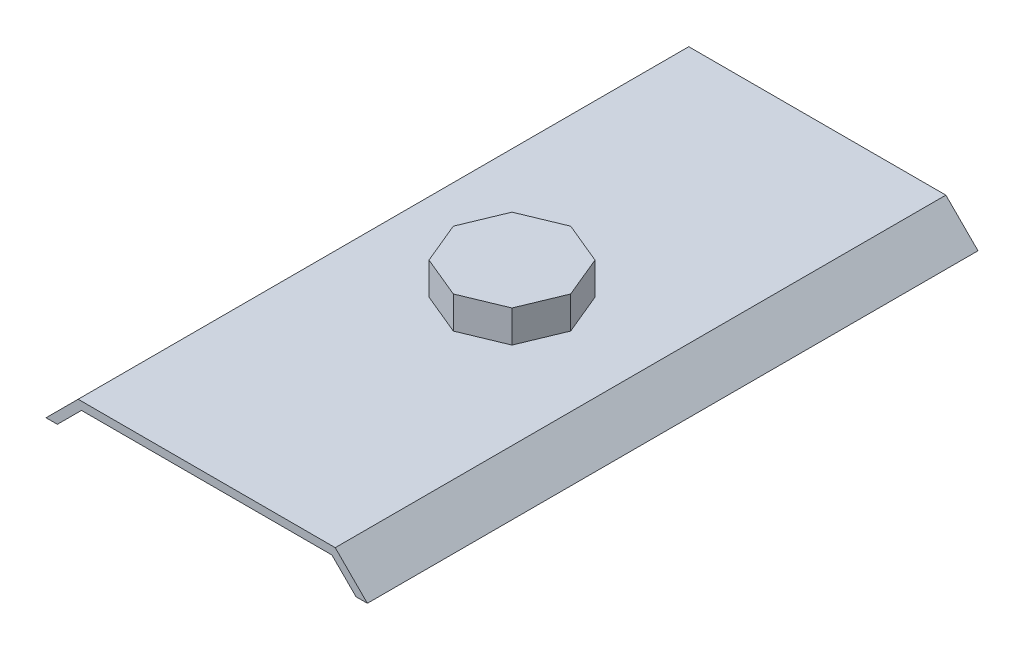
ISO-10303-21;
HEADER;
FILE_DESCRIPTION(('STEP AP214'),'2;1');
FILE_NAME('part.step','',(''),(''),'','','');
FILE_SCHEMA(('AUTOMOTIVE_DESIGN { 1 0 10303 214 1 1 1 1 }'));
ENDSEC;
DATA;
#1=APPLICATION_CONTEXT('core data for automotive mechanical design processes');
#2=APPLICATION_PROTOCOL_DEFINITION('international standard','automotive_design',2000,#1);
#3=PRODUCT_CONTEXT('',#1,'mechanical');
#4=PRODUCT('Part','Part','',(#3));
#5=PRODUCT_RELATED_PRODUCT_CATEGORY('part','',(#4));
#6=PRODUCT_DEFINITION_FORMATION('','',#4);
#7=PRODUCT_DEFINITION_CONTEXT('part definition',#1,'design');
#8=PRODUCT_DEFINITION('design','',#6,#7);
#9=PRODUCT_DEFINITION_SHAPE('','',#8);
#10=(LENGTH_UNIT() NAMED_UNIT(*) SI_UNIT(.MILLI.,.METRE.));
#11=(NAMED_UNIT(*) PLANE_ANGLE_UNIT() SI_UNIT($,.RADIAN.));
#12=(NAMED_UNIT(*) SI_UNIT($,.STERADIAN.) SOLID_ANGLE_UNIT());
#13=UNCERTAINTY_MEASURE_WITH_UNIT(LENGTH_MEASURE(1.E-05),#10,'distance_accuracy_value','');
#14=(GEOMETRIC_REPRESENTATION_CONTEXT(3) GLOBAL_UNCERTAINTY_ASSIGNED_CONTEXT((#13)) GLOBAL_UNIT_ASSIGNED_CONTEXT((#10,
#11,#12)) REPRESENTATION_CONTEXT('',''));
#15=CARTESIAN_POINT('',(0.,0.,0.));
#16=DIRECTION('',(0.,0.,1.));
#17=DIRECTION('',(1.,0.,0.));
#18=AXIS2_PLACEMENT_3D('',#15,#16,#17);
#19=CARTESIAN_POINT('',(-105.319743878931,105.319743878931,482.6));
#20=DIRECTION('',(-0.707106781186548,0.707106781186548,0.));
#21=DIRECTION('',(-0.707106781186548,-0.707106781186548,0.));
#22=AXIS2_PLACEMENT_3D('',#19,#20,#21);
#23=PLANE('',#22);
#24=DIRECTION('',(0.707106781186548,0.707106781186548,0.));
#25=VECTOR('',#24,1.);
#26=CARTESIAN_POINT('',(-105.319743878931,105.319743878931,-482.6));
#27=LINE('',#26,#25);
#28=CARTESIAN_POINT('',(-236.039487757862,-25.4,-482.6));
#29=VERTEX_POINT('',#28);
#30=CARTESIAN_POINT('',(-197.939487757862,12.7,-482.6));
#31=VERTEX_POINT('',#30);
#32=EDGE_CURVE('E209',#29,#31,#27,.T.);
#33=ORIENTED_EDGE('',*,*,#32,.T.);
#34=DIRECTION('',(0.,0.,-1.));
#35=VECTOR('',#34,1.);
#36=CARTESIAN_POINT('',(-197.939487757862,12.7,482.6));
#37=LINE('',#36,#35);
#38=CARTESIAN_POINT('',(-197.939487757862,12.7,482.6));
#39=VERTEX_POINT('',#38);
#40=EDGE_CURVE('E269',#39,#31,#37,.T.);
#41=ORIENTED_EDGE('',*,*,#40,.F.);
#42=DIRECTION('',(0.707106781186548,0.707106781186548,0.));
#43=VECTOR('',#42,1.);
#44=CARTESIAN_POINT('',(-105.319743878931,105.319743878931,482.6));
#45=LINE('',#44,#43);
#46=CARTESIAN_POINT('',(-236.039487757862,-25.4,482.6));
#47=VERTEX_POINT('',#46);
#48=EDGE_CURVE('E212',#47,#39,#45,.T.);
#49=ORIENTED_EDGE('',*,*,#48,.F.);
#50=DIRECTION('',(0.,0.,-1.));
#51=VECTOR('',#50,1.);
#52=CARTESIAN_POINT('',(-236.039487757862,-25.4,482.6));
#53=LINE('',#52,#51);
#54=EDGE_CURVE('E233',#47,#29,#53,.T.);
#55=ORIENTED_EDGE('',*,*,#54,.T.);
#56=EDGE_LOOP('',(#33,#41,#49,#55));
#57=FACE_BOUND('',#56,.T.);
#58=ADVANCED_FACE('F38',(#57),#23,.F.);
#59=CARTESIAN_POINT('',(0.,12.7,482.6));
#60=DIRECTION('',(0.,1.,0.));
#61=DIRECTION('',(-1.,0.,0.));
#62=AXIS2_PLACEMENT_3D('',#59,#60,#61);
#63=PLANE('',#62);
#64=CARTESIAN_POINT('',(-145.808181246566,12.7,-254.));
#65=DIRECTION('',(0.,1.,0.));
#66=DIRECTION('',(-1.,0.,0.));
#67=AXIS2_PLACEMENT_3D('',#64,#65,#66);
#68=CIRCLE('',#67,50.8);
#69=CARTESIAN_POINT('',(-196.608181246566,12.7,-254.));
#70=VERTEX_POINT('',#69);
#71=EDGE_CURVE('E11',#70,#70,#68,.F.);
#72=ORIENTED_EDGE('',*,*,#71,.F.);
#73=EDGE_LOOP('',(#72));
#74=FACE_BOUND('',#73,.T.);
#75=CARTESIAN_POINT('',(145.808181246566,12.7,-254.));
#76=DIRECTION('',(0.,-1.,0.));
#77=DIRECTION('',(1.,0.,0.));
#78=AXIS2_PLACEMENT_3D('',#75,#76,#77);
#79=CIRCLE('',#78,50.8);
#80=CARTESIAN_POINT('',(196.608181246566,12.7,-254.));
#81=VERTEX_POINT('',#80);
#82=EDGE_CURVE('E183',#81,#81,#79,.F.);
#83=ORIENTED_EDGE('',*,*,#82,.T.);
#84=EDGE_LOOP('',(#83));
#85=FACE_BOUND('',#84,.T.);
#86=CARTESIAN_POINT('',(145.808181246566,12.7,254.));
#87=DIRECTION('',(0.,1.,0.));
#88=DIRECTION('',(-1.,0.,0.));
#89=AXIS2_PLACEMENT_3D('',#86,#87,#88);
#90=CIRCLE('',#89,50.8);
#91=CARTESIAN_POINT('',(95.0081812465659,12.7,254.));
#92=VERTEX_POINT('',#91);
#93=EDGE_CURVE('E275',#92,#92,#90,.F.);
#94=ORIENTED_EDGE('',*,*,#93,.F.);
#95=EDGE_LOOP('',(#94));
#96=FACE_BOUND('',#95,.T.);
#97=CARTESIAN_POINT('',(-145.808181246566,12.7,254.));
#98=DIRECTION('',(0.,-1.,0.));
#99=DIRECTION('',(1.,0.,0.));
#100=AXIS2_PLACEMENT_3D('',#97,#98,#99);
#101=CIRCLE('',#100,50.8);
#102=CARTESIAN_POINT('',(-95.0081812465659,12.7,254.));
#103=VERTEX_POINT('',#102);
#104=EDGE_CURVE('E200',#103,#103,#101,.F.);
#105=ORIENTED_EDGE('',*,*,#104,.T.);
#106=EDGE_LOOP('',(#105));
#107=FACE_BOUND('',#106,.T.);
#108=DIRECTION('',(1.,0.,0.));
#109=VECTOR('',#108,1.);
#110=CARTESIAN_POINT('',(0.,12.7,-482.6));
#111=LINE('',#110,#109);
#112=CARTESIAN_POINT('',(197.939487757862,12.7,-482.6));
#113=VERTEX_POINT('',#112);
#114=EDGE_CURVE('E236',#31,#113,#111,.T.);
#115=ORIENTED_EDGE('',*,*,#114,.T.);
#116=DIRECTION('',(0.,0.,-1.));
#117=VECTOR('',#116,1.);
#118=CARTESIAN_POINT('',(197.939487757862,12.7,482.6));
#119=LINE('',#118,#117);
#120=CARTESIAN_POINT('',(197.939487757862,12.7,482.6));
#121=VERTEX_POINT('',#120);
#122=EDGE_CURVE('E267',#121,#113,#119,.T.);
#123=ORIENTED_EDGE('',*,*,#122,.F.);
#124=DIRECTION('',(1.,0.,0.));
#125=VECTOR('',#124,1.);
#126=CARTESIAN_POINT('',(0.,12.7,482.6));
#127=LINE('',#126,#125);
#128=EDGE_CURVE('E215',#39,#121,#127,.T.);
#129=ORIENTED_EDGE('',*,*,#128,.F.);
#130=ORIENTED_EDGE('',*,*,#40,.T.);
#131=EDGE_LOOP('',(#115,#123,#129,#130));
#132=FACE_BOUND('',#131,.T.);
#133=ADVANCED_FACE('F297',(#74,#85,#96,#107,#132),#63,.F.);
#134=CARTESIAN_POINT('',(105.319743878931,105.319743878931,482.6));
#135=DIRECTION('',(-0.707106781186547,-0.707106781186548,0.));
#136=DIRECTION('',(0.707106781186548,-0.707106781186547,0.));
#137=AXIS2_PLACEMENT_3D('',#134,#135,#136);
#138=PLANE('',#137);
#139=DIRECTION('',(-0.707106781186548,0.707106781186547,0.));
#140=VECTOR('',#139,1.);
#141=CARTESIAN_POINT('',(105.319743878931,105.319743878931,-482.6));
#142=LINE('',#141,#140);
#143=CARTESIAN_POINT('',(236.039487757862,-25.4,-482.6));
#144=VERTEX_POINT('',#143);
#145=EDGE_CURVE('E239',#144,#113,#142,.T.);
#146=ORIENTED_EDGE('',*,*,#145,.F.);
#147=DIRECTION('',(0.,0.,-1.));
#148=VECTOR('',#147,1.);
#149=CARTESIAN_POINT('',(236.039487757862,-25.4,482.6));
#150=LINE('',#149,#148);
#151=CARTESIAN_POINT('',(236.039487757862,-25.4,482.6));
#152=VERTEX_POINT('',#151);
#153=EDGE_CURVE('E265',#152,#144,#150,.T.);
#154=ORIENTED_EDGE('',*,*,#153,.F.);
#155=DIRECTION('',(-0.707106781186548,0.707106781186547,0.));
#156=VECTOR('',#155,1.);
#157=CARTESIAN_POINT('',(105.319743878931,105.319743878931,482.6));
#158=LINE('',#157,#156);
#159=EDGE_CURVE('E218',#152,#121,#158,.T.);
#160=ORIENTED_EDGE('',*,*,#159,.T.);
#161=ORIENTED_EDGE('',*,*,#122,.T.);
#162=EDGE_LOOP('',(#146,#154,#160,#161));
#163=FACE_BOUND('',#162,.T.);
#164=ADVANCED_FACE('F312',(#163),#138,.T.);
#165=CARTESIAN_POINT('',(0.,-25.4,482.6));
#166=DIRECTION('',(0.,1.,0.));
#167=DIRECTION('',(0.,0.,1.));
#168=AXIS2_PLACEMENT_3D('',#165,#166,#167);
#169=PLANE('',#168);
#170=DIRECTION('',(1.,0.,0.));
#171=VECTOR('',#170,1.);
#172=CARTESIAN_POINT('',(0.,-25.4,-482.6));
#173=LINE('',#172,#171);
#174=CARTESIAN_POINT('',(254.,-25.4,-482.6));
#175=VERTEX_POINT('',#174);
#176=EDGE_CURVE('E242',#144,#175,#173,.T.);
#177=ORIENTED_EDGE('',*,*,#176,.T.);
#178=DIRECTION('',(0.,0.,-1.));
#179=VECTOR('',#178,1.);
#180=CARTESIAN_POINT('',(254.,-25.4,482.6));
#181=LINE('',#180,#179);
#182=CARTESIAN_POINT('',(254.,-25.4,482.6));
#183=VERTEX_POINT('',#182);
#184=EDGE_CURVE('E262',#183,#175,#181,.T.);
#185=ORIENTED_EDGE('',*,*,#184,.F.);
#186=DIRECTION('',(1.,0.,0.));
#187=VECTOR('',#186,1.);
#188=CARTESIAN_POINT('',(0.,-25.4,482.6));
#189=LINE('',#188,#187);
#190=EDGE_CURVE('E221',#152,#183,#189,.T.);
#191=ORIENTED_EDGE('',*,*,#190,.F.);
#192=ORIENTED_EDGE('',*,*,#153,.T.);
#193=EDGE_LOOP('',(#177,#185,#191,#192));
#194=FACE_BOUND('',#193,.T.);
#195=ADVANCED_FACE('F347',(#194),#169,.F.);
#196=CARTESIAN_POINT('',(114.300000000001,114.3,482.6));
#197=DIRECTION('',(-0.707106781186549,-0.707106781186546,0.));
#198=DIRECTION('',(0.707106781186546,-0.707106781186549,0.));
#199=AXIS2_PLACEMENT_3D('',#196,#197,#198);
#200=PLANE('',#199);
#201=DIRECTION('',(-0.707106781186546,0.707106781186549,0.));
#202=VECTOR('',#201,1.);
#203=CARTESIAN_POINT('',(114.300000000001,114.3,-482.6));
#204=LINE('',#203,#202);
#205=CARTESIAN_POINT('',(203.2,25.4,-482.6));
#206=VERTEX_POINT('',#205);
#207=EDGE_CURVE('E244',#175,#206,#204,.T.);
#208=ORIENTED_EDGE('',*,*,#207,.T.);
#209=DIRECTION('',(0.,0.,-1.));
#210=VECTOR('',#209,1.);
#211=CARTESIAN_POINT('',(203.2,25.4,482.6));
#212=LINE('',#211,#210);
#213=CARTESIAN_POINT('',(203.2,25.4,482.6));
#214=VERTEX_POINT('',#213);
#215=EDGE_CURVE('E260',#214,#206,#212,.T.);
#216=ORIENTED_EDGE('',*,*,#215,.F.);
#217=DIRECTION('',(-0.707106781186546,0.707106781186549,0.));
#218=VECTOR('',#217,1.);
#219=CARTESIAN_POINT('',(114.300000000001,114.3,482.6));
#220=LINE('',#219,#218);
#221=EDGE_CURVE('E223',#183,#214,#220,.T.);
#222=ORIENTED_EDGE('',*,*,#221,.F.);
#223=ORIENTED_EDGE('',*,*,#184,.T.);
#224=EDGE_LOOP('',(#208,#216,#222,#223));
#225=FACE_BOUND('',#224,.T.);
#226=ADVANCED_FACE('F343',(#225),#200,.F.);
#227=CARTESIAN_POINT('',(0.,25.4,482.6));
#228=DIRECTION('',(0.,1.,0.));
#229=DIRECTION('',(0.,0.,1.));
#230=AXIS2_PLACEMENT_3D('',#227,#228,#229);
#231=PLANE('',#230);
#232=DIRECTION('',(0.382683432365079,0.,-0.923879532511291));
#233=VECTOR('',#232,1.);
#234=CARTESIAN_POINT('',(65.599833080608,25.4,65.5998330806064));
#235=LINE('',#234,#233);
#236=CARTESIAN_POINT('',(65.599833080608,25.4,65.5998330806064));
#237=VERTEX_POINT('',#236);
#238=CARTESIAN_POINT('',(92.7721736320058,25.4,-9.43689570931383E-13));
#239=VERTEX_POINT('',#238);
#240=EDGE_CURVE('E52',#237,#239,#235,.T.);
#241=ORIENTED_EDGE('',*,*,#240,.F.);
#242=DIRECTION('',(0.923879532511283,0.,-0.3826834323651));
#243=VECTOR('',#242,1.);
#244=CARTESIAN_POINT('',(9.66056281725772E-13,25.4,92.7721736320058));
#245=LINE('',#244,#243);
#246=CARTESIAN_POINT('',(9.66056281725772E-13,25.4,92.7721736320058));
#247=VERTEX_POINT('',#246);
#248=EDGE_CURVE('E56',#247,#237,#245,.T.);
#249=ORIENTED_EDGE('',*,*,#248,.F.);
#250=DIRECTION('',(0.923879532511291,0.,0.38268343236508));
#251=VECTOR('',#250,1.);
#252=CARTESIAN_POINT('',(-65.5998330806065,25.4,65.5998330806078));
#253=LINE('',#252,#251);
#254=CARTESIAN_POINT('',(-65.5998330806065,25.4,65.5998330806078));
#255=VERTEX_POINT('',#254);
#256=EDGE_CURVE('E658',#255,#247,#253,.T.);
#257=ORIENTED_EDGE('',*,*,#256,.F.);
#258=DIRECTION('',(0.382683432365099,0.,0.923879532511283));
#259=VECTOR('',#258,1.);
#260=CARTESIAN_POINT('',(-92.7721736320058,25.4,9.29811783123569E-13));
#261=LINE('',#260,#259);
#262=CARTESIAN_POINT('',(-92.7721736320058,25.4,9.29811783123569E-13));
#263=VERTEX_POINT('',#262);
#264=EDGE_CURVE('E692',#263,#255,#261,.T.);
#265=ORIENTED_EDGE('',*,*,#264,.F.);
#266=DIRECTION('',(-0.38268343236508,0.,0.923879532511291));
#267=VECTOR('',#266,1.);
#268=CARTESIAN_POINT('',(-65.5998330806078,25.4,-65.5998330806065));
#269=LINE('',#268,#267);
#270=CARTESIAN_POINT('',(-65.5998330806078,25.4,-65.5998330806065));
#271=VERTEX_POINT('',#270);
#272=EDGE_CURVE('E685',#271,#263,#269,.T.);
#273=ORIENTED_EDGE('',*,*,#272,.F.);
#274=DIRECTION('',(-0.923879532511283,0.,0.382683432365099));
#275=VECTOR('',#274,1.);
#276=CARTESIAN_POINT('',(-9.57567358739198E-13,25.4,-92.7721736320059));
#277=LINE('',#276,#275);
#278=CARTESIAN_POINT('',(-9.57567358739198E-13,25.4,-92.7721736320059));
#279=VERTEX_POINT('',#278);
#280=EDGE_CURVE('E679',#279,#271,#277,.T.);
#281=ORIENTED_EDGE('',*,*,#280,.F.);
#282=DIRECTION('',(-0.923879532511291,0.,-0.38268343236508));
#283=VECTOR('',#282,1.);
#284=CARTESIAN_POINT('',(65.5998330806065,25.4,-65.5998330806078));
#285=LINE('',#284,#283);
#286=CARTESIAN_POINT('',(65.5998330806065,25.4,-65.5998330806078));
#287=VERTEX_POINT('',#286);
#288=EDGE_CURVE('E682',#287,#279,#285,.T.);
#289=ORIENTED_EDGE('',*,*,#288,.F.);
#290=DIRECTION('',(-0.382683432365099,0.,-0.923879532511283));
#291=VECTOR('',#290,1.);
#292=CARTESIAN_POINT('',(92.7721736320058,25.4,-9.43689570931383E-13));
#293=LINE('',#292,#291);
#294=EDGE_CURVE('E683',#239,#287,#293,.T.);
#295=ORIENTED_EDGE('',*,*,#294,.F.);
#296=EDGE_LOOP('',(#241,#249,#257,#265,#273,#281,#289,#295));
#297=FACE_BOUND('',#296,.T.);
#298=DIRECTION('',(1.,0.,0.));
#299=VECTOR('',#298,1.);
#300=CARTESIAN_POINT('',(0.,25.4,-482.6));
#301=LINE('',#300,#299);
#302=CARTESIAN_POINT('',(-203.2,25.4,-482.6));
#303=VERTEX_POINT('',#302);
#304=EDGE_CURVE('E247',#303,#206,#301,.T.);
#305=ORIENTED_EDGE('',*,*,#304,.F.);
#306=DIRECTION('',(0.,0.,-1.));
#307=VECTOR('',#306,1.);
#308=CARTESIAN_POINT('',(-203.2,25.4,482.6));
#309=LINE('',#308,#307);
#310=CARTESIAN_POINT('',(-203.2,25.4,482.6));
#311=VERTEX_POINT('',#310);
#312=EDGE_CURVE('E258',#311,#303,#309,.T.);
#313=ORIENTED_EDGE('',*,*,#312,.F.);
#314=DIRECTION('',(1.,0.,0.));
#315=VECTOR('',#314,1.);
#316=CARTESIAN_POINT('',(0.,25.4,482.6));
#317=LINE('',#316,#315);
#318=EDGE_CURVE('E225',#311,#214,#317,.T.);
#319=ORIENTED_EDGE('',*,*,#318,.T.);
#320=ORIENTED_EDGE('',*,*,#215,.T.);
#321=EDGE_LOOP('',(#305,#313,#319,#320));
#322=FACE_BOUND('',#321,.T.);
#323=ADVANCED_FACE('F339',(#297,#322),#231,.T.);
#324=CARTESIAN_POINT('',(-114.3,114.3,482.6));
#325=DIRECTION('',(-0.707106781186549,0.707106781186547,0.));
#326=DIRECTION('',(-0.707106781186547,-0.707106781186549,0.));
#327=AXIS2_PLACEMENT_3D('',#324,#325,#326);
#328=PLANE('',#327);
#329=DIRECTION('',(0.707106781186546,0.707106781186549,0.));
#330=VECTOR('',#329,1.);
#331=CARTESIAN_POINT('',(-114.3,114.3,-482.6));
#332=LINE('',#331,#330);
#333=CARTESIAN_POINT('',(-254.,-25.4,-482.6));
#334=VERTEX_POINT('',#333);
#335=EDGE_CURVE('E250',#334,#303,#332,.T.);
#336=ORIENTED_EDGE('',*,*,#335,.F.);
#337=DIRECTION('',(0.,0.,-1.));
#338=VECTOR('',#337,1.);
#339=CARTESIAN_POINT('',(-254.,-25.4,482.6));
#340=LINE('',#339,#338);
#341=CARTESIAN_POINT('',(-254.,-25.4,482.6));
#342=VERTEX_POINT('',#341);
#343=EDGE_CURVE('E256',#342,#334,#340,.T.);
#344=ORIENTED_EDGE('',*,*,#343,.F.);
#345=DIRECTION('',(0.707106781186546,0.707106781186549,0.));
#346=VECTOR('',#345,1.);
#347=CARTESIAN_POINT('',(-114.3,114.3,482.6));
#348=LINE('',#347,#346);
#349=EDGE_CURVE('E228',#342,#311,#348,.T.);
#350=ORIENTED_EDGE('',*,*,#349,.T.);
#351=ORIENTED_EDGE('',*,*,#312,.T.);
#352=EDGE_LOOP('',(#336,#344,#350,#351));
#353=FACE_BOUND('',#352,.T.);
#354=ADVANCED_FACE('F335',(#353),#328,.T.);
#355=CARTESIAN_POINT('',(0.,-25.4,482.6));
#356=DIRECTION('',(0.,1.,0.));
#357=DIRECTION('',(0.,0.,1.));
#358=AXIS2_PLACEMENT_3D('',#355,#356,#357);
#359=PLANE('',#358);
#360=DIRECTION('',(1.,0.,0.));
#361=VECTOR('',#360,1.);
#362=CARTESIAN_POINT('',(0.,-25.4,-482.6));
#363=LINE('',#362,#361);
#364=EDGE_CURVE('E216',#334,#29,#363,.T.);
#365=ORIENTED_EDGE('',*,*,#364,.T.);
#366=ORIENTED_EDGE('',*,*,#54,.F.);
#367=DIRECTION('',(1.,0.,0.));
#368=VECTOR('',#367,1.);
#369=CARTESIAN_POINT('',(0.,-25.4,482.6));
#370=LINE('',#369,#368);
#371=EDGE_CURVE('E231',#342,#47,#370,.T.);
#372=ORIENTED_EDGE('',*,*,#371,.F.);
#373=ORIENTED_EDGE('',*,*,#343,.T.);
#374=EDGE_LOOP('',(#365,#366,#372,#373));
#375=FACE_BOUND('',#374,.T.);
#376=ADVANCED_FACE('F333',(#375),#359,.F.);
#377=CARTESIAN_POINT('',(0.,0.,482.6));
#378=DIRECTION('',(0.,0.,1.));
#379=DIRECTION('',(1.,0.,0.));
#380=AXIS2_PLACEMENT_3D('',#377,#378,#379);
#381=PLANE('',#380);
#382=ORIENTED_EDGE('',*,*,#48,.T.);
#383=ORIENTED_EDGE('',*,*,#128,.T.);
#384=ORIENTED_EDGE('',*,*,#159,.F.);
#385=ORIENTED_EDGE('',*,*,#190,.T.);
#386=ORIENTED_EDGE('',*,*,#221,.T.);
#387=ORIENTED_EDGE('',*,*,#318,.F.);
#388=ORIENTED_EDGE('',*,*,#349,.F.);
#389=ORIENTED_EDGE('',*,*,#371,.T.);
#390=EDGE_LOOP('',(#382,#383,#384,#385,#386,#387,#388,#389));
#391=FACE_BOUND('',#390,.T.);
#392=ADVANCED_FACE('F328',(#391),#381,.T.);
#393=CARTESIAN_POINT('',(0.,0.,-482.6));
#394=DIRECTION('',(0.,0.,1.));
#395=DIRECTION('',(1.,0.,0.));
#396=AXIS2_PLACEMENT_3D('',#393,#394,#395);
#397=PLANE('',#396);
#398=ORIENTED_EDGE('',*,*,#32,.F.);
#399=ORIENTED_EDGE('',*,*,#364,.F.);
#400=ORIENTED_EDGE('',*,*,#335,.T.);
#401=ORIENTED_EDGE('',*,*,#304,.T.);
#402=ORIENTED_EDGE('',*,*,#207,.F.);
#403=ORIENTED_EDGE('',*,*,#176,.F.);
#404=ORIENTED_EDGE('',*,*,#145,.T.);
#405=ORIENTED_EDGE('',*,*,#114,.F.);
#406=EDGE_LOOP('',(#398,#399,#400,#401,#402,#403,#404,#405));
#407=FACE_BOUND('',#406,.T.);
#408=ADVANCED_FACE('F320',(#407),#397,.F.);
#409=CARTESIAN_POINT('',(-145.808181246566,-38.1,254.));
#410=DIRECTION('',(0.,1.,0.));
#411=DIRECTION('',(-1.,0.,0.));
#412=AXIS2_PLACEMENT_3D('',#409,#410,#411);
#413=CYLINDRICAL_SURFACE('',#412,50.8);
#414=CARTESIAN_POINT('',(-145.808181246566,-38.1,254.));
#415=DIRECTION('',(0.,-1.,0.));
#416=DIRECTION('',(1.,0.,0.));
#417=AXIS2_PLACEMENT_3D('',#414,#415,#416);
#418=CIRCLE('',#417,50.8);
#419=CARTESIAN_POINT('',(-95.0081812465659,-38.1,254.));
#420=VERTEX_POINT('',#419);
#421=EDGE_CURVE('E203',#420,#420,#418,.F.);
#422=ORIENTED_EDGE('',*,*,#421,.T.);
#423=EDGE_LOOP('',(#422));
#424=FACE_BOUND('',#423,.T.);
#425=ORIENTED_EDGE('',*,*,#104,.F.);
#426=EDGE_LOOP('',(#425));
#427=FACE_BOUND('',#426,.T.);
#428=ADVANCED_FACE('F365',(#424,#427),#413,.T.);
#429=CARTESIAN_POINT('',(-145.808181246566,-38.1,254.));
#430=DIRECTION('',(0.,1.,0.));
#431=DIRECTION('',(-1.,0.,0.));
#432=AXIS2_PLACEMENT_3D('',#429,#430,#431);
#433=CYLINDRICAL_SURFACE('',#432,25.4);
#434=CARTESIAN_POINT('',(-145.808181246566,-38.1,254.));
#435=DIRECTION('',(0.,-1.,0.));
#436=DIRECTION('',(1.,0.,0.));
#437=AXIS2_PLACEMENT_3D('',#434,#435,#436);
#438=CIRCLE('',#437,25.4);
#439=CARTESIAN_POINT('',(-120.408181246566,-38.1,254.));
#440=VERTEX_POINT('',#439);
#441=EDGE_CURVE('E206',#440,#440,#438,.F.);
#442=ORIENTED_EDGE('',*,*,#441,.F.);
#443=EDGE_LOOP('',(#442));
#444=FACE_BOUND('',#443,.T.);
#445=CARTESIAN_POINT('',(-145.808181246566,12.7,254.));
#446=DIRECTION('',(0.,1.,0.));
#447=DIRECTION('',(-1.,0.,0.));
#448=AXIS2_PLACEMENT_3D('',#445,#446,#447);
#449=CIRCLE('',#448,25.4);
#450=CARTESIAN_POINT('',(-171.208181246566,12.7,254.));
#451=VERTEX_POINT('',#450);
#452=EDGE_CURVE('E272',#451,#451,#449,.T.);
#453=ORIENTED_EDGE('',*,*,#452,.T.);
#454=EDGE_LOOP('',(#453));
#455=FACE_BOUND('',#454,.T.);
#456=ADVANCED_FACE('F370',(#444,#455),#433,.F.);
#457=CARTESIAN_POINT('',(0.,-38.1,0.));
#458=DIRECTION('',(0.,-1.,0.));
#459=DIRECTION('',(1.,0.,0.));
#460=AXIS2_PLACEMENT_3D('',#457,#458,#459);
#461=PLANE('',#460);
#462=ORIENTED_EDGE('',*,*,#421,.F.);
#463=EDGE_LOOP('',(#462));
#464=FACE_BOUND('',#463,.T.);
#465=ORIENTED_EDGE('',*,*,#441,.T.);
#466=EDGE_LOOP('',(#465));
#467=FACE_BOUND('',#466,.T.);
#468=ADVANCED_FACE('F374',(#464,#467),#461,.T.);
#469=ORIENTED_EDGE('',*,*,#452,.F.);
#470=EDGE_LOOP('',(#469));
#471=FACE_BOUND('',#470,.T.);
#472=ADVANCED_FACE('F303',(#471),#63,.F.);
#473=CARTESIAN_POINT('',(145.808181246566,-38.1,254.));
#474=DIRECTION('',(0.,1.,0.));
#475=DIRECTION('',(-1.,0.,0.));
#476=AXIS2_PLACEMENT_3D('',#473,#474,#475);
#477=CYLINDRICAL_SURFACE('',#476,25.4);
#478=CARTESIAN_POINT('',(145.808181246566,-38.1,254.));
#479=DIRECTION('',(0.,-1.,0.));
#480=DIRECTION('',(1.,0.,0.));
#481=AXIS2_PLACEMENT_3D('',#478,#479,#480);
#482=CIRCLE('',#481,25.4);
#483=CARTESIAN_POINT('',(171.208181246566,-38.1,254.));
#484=VERTEX_POINT('',#483);
#485=EDGE_CURVE('E194',#484,#484,#482,.T.);
#486=ORIENTED_EDGE('',*,*,#485,.T.);
#487=EDGE_LOOP('',(#486));
#488=FACE_BOUND('',#487,.T.);
#489=CARTESIAN_POINT('',(145.808181246566,12.7,254.));
#490=DIRECTION('',(0.,-1.,0.));
#491=DIRECTION('',(1.,0.,0.));
#492=AXIS2_PLACEMENT_3D('',#489,#490,#491);
#493=CIRCLE('',#492,25.4);
#494=CARTESIAN_POINT('',(171.208181246566,12.7,254.));
#495=VERTEX_POINT('',#494);
#496=EDGE_CURVE('E191',#495,#495,#493,.T.);
#497=ORIENTED_EDGE('',*,*,#496,.F.);
#498=EDGE_LOOP('',(#497));
#499=FACE_BOUND('',#498,.T.);
#500=ADVANCED_FACE('F379',(#488,#499),#477,.F.);
#501=CARTESIAN_POINT('',(145.808181246566,-38.1,254.));
#502=DIRECTION('',(0.,1.,0.));
#503=DIRECTION('',(-1.,0.,0.));
#504=AXIS2_PLACEMENT_3D('',#501,#502,#503);
#505=CYLINDRICAL_SURFACE('',#504,50.8);
#506=CARTESIAN_POINT('',(145.808181246566,-38.1,254.));
#507=DIRECTION('',(0.,-1.,0.));
#508=DIRECTION('',(1.,0.,0.));
#509=AXIS2_PLACEMENT_3D('',#506,#507,#508);
#510=CIRCLE('',#509,50.8);
#511=CARTESIAN_POINT('',(196.608181246566,-38.1,254.));
#512=VERTEX_POINT('',#511);
#513=EDGE_CURVE('E197',#512,#512,#510,.T.);
#514=ORIENTED_EDGE('',*,*,#513,.F.);
#515=EDGE_LOOP('',(#514));
#516=FACE_BOUND('',#515,.T.);
#517=ORIENTED_EDGE('',*,*,#93,.T.);
#518=EDGE_LOOP('',(#517));
#519=FACE_BOUND('',#518,.T.);
#520=ADVANCED_FACE('F382',(#516,#519),#505,.T.);
#521=CARTESIAN_POINT('',(0.,-38.1,0.));
#522=DIRECTION('',(0.,-1.,0.));
#523=DIRECTION('',(1.,0.,0.));
#524=AXIS2_PLACEMENT_3D('',#521,#522,#523);
#525=PLANE('',#524);
#526=ORIENTED_EDGE('',*,*,#485,.F.);
#527=EDGE_LOOP('',(#526));
#528=FACE_BOUND('',#527,.T.);
#529=ORIENTED_EDGE('',*,*,#513,.T.);
#530=EDGE_LOOP('',(#529));
#531=FACE_BOUND('',#530,.T.);
#532=ADVANCED_FACE('F301',(#528,#531),#525,.T.);
#533=ORIENTED_EDGE('',*,*,#496,.T.);
#534=EDGE_LOOP('',(#533));
#535=FACE_BOUND('',#534,.T.);
#536=ADVANCED_FACE('F286',(#535),#63,.F.);
#537=CARTESIAN_POINT('',(145.808181246566,-38.1,-254.));
#538=DIRECTION('',(0.,1.,0.));
#539=DIRECTION('',(-1.,0.,0.));
#540=AXIS2_PLACEMENT_3D('',#537,#538,#539);
#541=CYLINDRICAL_SURFACE('',#540,50.8);
#542=CARTESIAN_POINT('',(145.808181246566,-38.1,-254.));
#543=DIRECTION('',(0.,-1.,0.));
#544=DIRECTION('',(1.,0.,0.));
#545=AXIS2_PLACEMENT_3D('',#542,#543,#544);
#546=CIRCLE('',#545,50.8);
#547=CARTESIAN_POINT('',(196.608181246566,-38.1,-254.));
#548=VERTEX_POINT('',#547);
#549=EDGE_CURVE('E185',#548,#548,#546,.F.);
#550=ORIENTED_EDGE('',*,*,#549,.T.);
#551=EDGE_LOOP('',(#550));
#552=FACE_BOUND('',#551,.T.);
#553=ORIENTED_EDGE('',*,*,#82,.F.);
#554=EDGE_LOOP('',(#553));
#555=FACE_BOUND('',#554,.T.);
#556=ADVANCED_FACE('F300',(#552,#555),#541,.T.);
#557=CARTESIAN_POINT('',(145.808181246566,-38.1,-254.));
#558=DIRECTION('',(0.,1.,0.));
#559=DIRECTION('',(-1.,0.,0.));
#560=AXIS2_PLACEMENT_3D('',#557,#558,#559);
#561=CYLINDRICAL_SURFACE('',#560,25.4);
#562=CARTESIAN_POINT('',(145.808181246566,-38.1,-254.));
#563=DIRECTION('',(0.,-1.,0.));
#564=DIRECTION('',(1.,0.,0.));
#565=AXIS2_PLACEMENT_3D('',#562,#563,#564);
#566=CIRCLE('',#565,25.4);
#567=CARTESIAN_POINT('',(171.208181246566,-38.1,-254.));
#568=VERTEX_POINT('',#567);
#569=EDGE_CURVE('E188',#568,#568,#566,.F.);
#570=ORIENTED_EDGE('',*,*,#569,.F.);
#571=EDGE_LOOP('',(#570));
#572=FACE_BOUND('',#571,.T.);
#573=CARTESIAN_POINT('',(145.808181246566,12.7,-254.));
#574=DIRECTION('',(0.,1.,0.));
#575=DIRECTION('',(-1.,0.,0.));
#576=AXIS2_PLACEMENT_3D('',#573,#574,#575);
#577=CIRCLE('',#576,25.4);
#578=CARTESIAN_POINT('',(120.408181246566,12.7,-254.));
#579=VERTEX_POINT('',#578);
#580=EDGE_CURVE('E45',#579,#579,#577,.T.);
#581=ORIENTED_EDGE('',*,*,#580,.T.);
#582=EDGE_LOOP('',(#581));
#583=FACE_BOUND('',#582,.T.);
#584=ADVANCED_FACE('F280',(#572,#583),#561,.F.);
#585=CARTESIAN_POINT('',(0.,-38.1,0.));
#586=DIRECTION('',(0.,-1.,0.));
#587=DIRECTION('',(1.,0.,0.));
#588=AXIS2_PLACEMENT_3D('',#585,#586,#587);
#589=PLANE('',#588);
#590=ORIENTED_EDGE('',*,*,#549,.F.);
#591=EDGE_LOOP('',(#590));
#592=FACE_BOUND('',#591,.T.);
#593=ORIENTED_EDGE('',*,*,#569,.T.);
#594=EDGE_LOOP('',(#593));
#595=FACE_BOUND('',#594,.T.);
#596=ADVANCED_FACE('F285',(#592,#595),#589,.T.);
#597=ORIENTED_EDGE('',*,*,#580,.F.);
#598=EDGE_LOOP('',(#597));
#599=FACE_BOUND('',#598,.T.);
#600=ADVANCED_FACE('F282',(#599),#63,.F.);
#601=CARTESIAN_POINT('',(-145.808181246566,-38.1,-254.));
#602=DIRECTION('',(0.,1.,0.));
#603=DIRECTION('',(-1.,0.,0.));
#604=AXIS2_PLACEMENT_3D('',#601,#602,#603);
#605=CYLINDRICAL_SURFACE('',#604,25.4);
#606=CARTESIAN_POINT('',(-145.808181246566,-38.1,-254.));
#607=DIRECTION('',(0.,-1.,0.));
#608=DIRECTION('',(1.,0.,0.));
#609=AXIS2_PLACEMENT_3D('',#606,#607,#608);
#610=CIRCLE('',#609,25.4);
#611=CARTESIAN_POINT('',(-120.408181246566,-38.1,-254.));
#612=VERTEX_POINT('',#611);
#613=EDGE_CURVE('E173',#612,#612,#610,.T.);
#614=ORIENTED_EDGE('',*,*,#613,.T.);
#615=EDGE_LOOP('',(#614));
#616=FACE_BOUND('',#615,.T.);
#617=CARTESIAN_POINT('',(-145.808181246566,12.7,-254.));
#618=DIRECTION('',(0.,-1.,0.));
#619=DIRECTION('',(1.,0.,0.));
#620=AXIS2_PLACEMENT_3D('',#617,#618,#619);
#621=CIRCLE('',#620,25.4);
#622=CARTESIAN_POINT('',(-120.408181246566,12.7,-254.));
#623=VERTEX_POINT('',#622);
#624=EDGE_CURVE('E170',#623,#623,#621,.T.);
#625=ORIENTED_EDGE('',*,*,#624,.F.);
#626=EDGE_LOOP('',(#625));
#627=FACE_BOUND('',#626,.T.);
#628=ADVANCED_FACE('F284',(#616,#627),#605,.F.);
#629=CARTESIAN_POINT('',(-145.808181246566,-38.1,-254.));
#630=DIRECTION('',(0.,1.,0.));
#631=DIRECTION('',(-1.,0.,0.));
#632=AXIS2_PLACEMENT_3D('',#629,#630,#631);
#633=CYLINDRICAL_SURFACE('',#632,50.8);
#634=CARTESIAN_POINT('',(-145.808181246566,-38.1,-254.));
#635=DIRECTION('',(0.,-1.,0.));
#636=DIRECTION('',(1.,0.,0.));
#637=AXIS2_PLACEMENT_3D('',#634,#635,#636);
#638=CIRCLE('',#637,50.8);
#639=CARTESIAN_POINT('',(-95.0081812465659,-38.1,-254.));
#640=VERTEX_POINT('',#639);
#641=EDGE_CURVE('E181',#640,#640,#638,.T.);
#642=ORIENTED_EDGE('',*,*,#641,.F.);
#643=EDGE_LOOP('',(#642));
#644=FACE_BOUND('',#643,.T.);
#645=ORIENTED_EDGE('',*,*,#71,.T.);
#646=EDGE_LOOP('',(#645));
#647=FACE_BOUND('',#646,.T.);
#648=ADVANCED_FACE('F292',(#644,#647),#633,.T.);
#649=CARTESIAN_POINT('',(0.,-38.1,0.));
#650=DIRECTION('',(0.,-1.,0.));
#651=DIRECTION('',(1.,0.,0.));
#652=AXIS2_PLACEMENT_3D('',#649,#650,#651);
#653=PLANE('',#652);
#654=ORIENTED_EDGE('',*,*,#613,.F.);
#655=EDGE_LOOP('',(#654));
#656=FACE_BOUND('',#655,.T.);
#657=ORIENTED_EDGE('',*,*,#641,.T.);
#658=EDGE_LOOP('',(#657));
#659=FACE_BOUND('',#658,.T.);
#660=ADVANCED_FACE('F305',(#656,#659),#653,.T.);
#661=ORIENTED_EDGE('',*,*,#624,.T.);
#662=EDGE_LOOP('',(#661));
#663=FACE_BOUND('',#662,.T.);
#664=ADVANCED_FACE('F287',(#663),#63,.F.);
#665=CARTESIAN_POINT('',(65.599833080608,76.2,65.5998330806064));
#666=DIRECTION('',(-0.923879532511291,0.,-0.382683432365079));
#667=DIRECTION('',(-0.382683432365079,0.,0.923879532511291));
#668=AXIS2_PLACEMENT_3D('',#665,#666,#667);
#669=PLANE('',#668);
#670=ORIENTED_EDGE('',*,*,#240,.T.);
#671=DIRECTION('',(0.,-1.,0.));
#672=VECTOR('',#671,1.);
#673=CARTESIAN_POINT('',(92.7721736320058,76.2,-9.43689570931383E-13));
#674=LINE('',#673,#672);
#675=CARTESIAN_POINT('',(92.7721736320058,76.2,-9.43689570931383E-13));
#676=VERTEX_POINT('',#675);
#677=EDGE_CURVE('E153',#676,#239,#674,.T.);
#678=ORIENTED_EDGE('',*,*,#677,.F.);
#679=DIRECTION('',(0.382683432365079,0.,-0.923879532511291));
#680=VECTOR('',#679,1.);
#681=CARTESIAN_POINT('',(65.599833080608,76.2,65.5998330806064));
#682=LINE('',#681,#680);
#683=CARTESIAN_POINT('',(65.599833080608,76.2,65.5998330806064));
#684=VERTEX_POINT('',#683);
#685=EDGE_CURVE('E159',#684,#676,#682,.T.);
#686=ORIENTED_EDGE('',*,*,#685,.F.);
#687=DIRECTION('',(0.,-1.,0.));
#688=VECTOR('',#687,1.);
#689=CARTESIAN_POINT('',(65.599833080608,76.2,65.5998330806064));
#690=LINE('',#689,#688);
#691=EDGE_CURVE('E655',#684,#237,#690,.T.);
#692=ORIENTED_EDGE('',*,*,#691,.T.);
#693=EDGE_LOOP('',(#670,#678,#686,#692));
#694=FACE_BOUND('',#693,.T.);
#695=ADVANCED_FACE('F169',(#694),#669,.F.);
#696=CARTESIAN_POINT('',(92.7721736320058,76.2,-9.43689570931383E-13));
#697=DIRECTION('',(-0.923879532511283,0.,0.382683432365099));
#698=DIRECTION('',(0.382683432365099,0.,0.923879532511283));
#699=AXIS2_PLACEMENT_3D('',#696,#697,#698);
#700=PLANE('',#699);
#701=ORIENTED_EDGE('',*,*,#294,.T.);
#702=DIRECTION('',(0.,-1.,0.));
#703=VECTOR('',#702,1.);
#704=CARTESIAN_POINT('',(65.5998330806065,76.2,-65.5998330806078));
#705=LINE('',#704,#703);
#706=CARTESIAN_POINT('',(65.5998330806065,76.2,-65.5998330806078));
#707=VERTEX_POINT('',#706);
#708=EDGE_CURVE('E155',#707,#287,#705,.T.);
#709=ORIENTED_EDGE('',*,*,#708,.F.);
#710=DIRECTION('',(-0.382683432365099,0.,-0.923879532511283));
#711=VECTOR('',#710,1.);
#712=CARTESIAN_POINT('',(92.7721736320058,76.2,-9.43689570931383E-13));
#713=LINE('',#712,#711);
#714=EDGE_CURVE('E148',#676,#707,#713,.T.);
#715=ORIENTED_EDGE('',*,*,#714,.F.);
#716=ORIENTED_EDGE('',*,*,#677,.T.);
#717=EDGE_LOOP('',(#701,#709,#715,#716));
#718=FACE_BOUND('',#717,.T.);
#719=ADVANCED_FACE('F151',(#718),#700,.F.);
#720=CARTESIAN_POINT('',(65.5998330806065,76.2,-65.5998330806078));
#721=DIRECTION('',(-0.38268343236508,0.,0.923879532511291));
#722=DIRECTION('',(0.923879532511291,0.,0.38268343236508));
#723=AXIS2_PLACEMENT_3D('',#720,#721,#722);
#724=PLANE('',#723);
#725=ORIENTED_EDGE('',*,*,#288,.T.);
#726=DIRECTION('',(0.,-1.,0.));
#727=VECTOR('',#726,1.);
#728=CARTESIAN_POINT('',(-9.57567358739198E-13,76.2,-92.7721736320059));
#729=LINE('',#728,#727);
#730=CARTESIAN_POINT('',(-9.57567358739198E-13,76.2,-92.7721736320059));
#731=VERTEX_POINT('',#730);
#732=EDGE_CURVE('E175',#731,#279,#729,.T.);
#733=ORIENTED_EDGE('',*,*,#732,.F.);
#734=DIRECTION('',(-0.923879532511291,0.,-0.38268343236508));
#735=VECTOR('',#734,1.);
#736=CARTESIAN_POINT('',(65.5998330806065,76.2,-65.5998330806078));
#737=LINE('',#736,#735);
#738=EDGE_CURVE('E158',#707,#731,#737,.T.);
#739=ORIENTED_EDGE('',*,*,#738,.F.);
#740=ORIENTED_EDGE('',*,*,#708,.T.);
#741=EDGE_LOOP('',(#725,#733,#739,#740));
#742=FACE_BOUND('',#741,.T.);
#743=ADVANCED_FACE('F406',(#742),#724,.F.);
#744=CARTESIAN_POINT('',(-9.57567358739198E-13,76.2,-92.7721736320059));
#745=DIRECTION('',(0.382683432365099,0.,0.923879532511283));
#746=DIRECTION('',(0.923879532511283,0.,-0.382683432365099));
#747=AXIS2_PLACEMENT_3D('',#744,#745,#746);
#748=PLANE('',#747);
#749=ORIENTED_EDGE('',*,*,#280,.T.);
#750=DIRECTION('',(0.,-1.,0.));
#751=VECTOR('',#750,1.);
#752=CARTESIAN_POINT('',(-65.5998330806078,76.2,-65.5998330806065));
#753=LINE('',#752,#751);
#754=CARTESIAN_POINT('',(-65.5998330806078,76.2,-65.5998330806065));
#755=VERTEX_POINT('',#754);
#756=EDGE_CURVE('E672',#755,#271,#753,.T.);
#757=ORIENTED_EDGE('',*,*,#756,.F.);
#758=DIRECTION('',(-0.923879532511283,0.,0.382683432365099));
#759=VECTOR('',#758,1.);
#760=CARTESIAN_POINT('',(-9.57567358739198E-13,76.2,-92.7721736320059));
#761=LINE('',#760,#759);
#762=EDGE_CURVE('E680',#731,#755,#761,.T.);
#763=ORIENTED_EDGE('',*,*,#762,.F.);
#764=ORIENTED_EDGE('',*,*,#732,.T.);
#765=EDGE_LOOP('',(#749,#757,#763,#764));
#766=FACE_BOUND('',#765,.T.);
#767=ADVANCED_FACE('F409',(#766),#748,.F.);
#768=CARTESIAN_POINT('',(-65.5998330806078,76.2,-65.5998330806065));
#769=DIRECTION('',(0.923879532511291,0.,0.38268343236508));
#770=DIRECTION('',(0.38268343236508,0.,-0.923879532511291));
#771=AXIS2_PLACEMENT_3D('',#768,#769,#770);
#772=PLANE('',#771);
#773=ORIENTED_EDGE('',*,*,#272,.T.);
#774=DIRECTION('',(0.,-1.,0.));
#775=VECTOR('',#774,1.);
#776=CARTESIAN_POINT('',(-92.7721736320058,76.2,9.29811783123569E-13));
#777=LINE('',#776,#775);
#778=CARTESIAN_POINT('',(-92.7721736320058,76.2,9.29811783123569E-13));
#779=VERTEX_POINT('',#778);
#780=EDGE_CURVE('E669',#779,#263,#777,.T.);
#781=ORIENTED_EDGE('',*,*,#780,.F.);
#782=DIRECTION('',(-0.38268343236508,0.,0.923879532511291));
#783=VECTOR('',#782,1.);
#784=CARTESIAN_POINT('',(-65.5998330806078,76.2,-65.5998330806065));
#785=LINE('',#784,#783);
#786=EDGE_CURVE('E700',#755,#779,#785,.T.);
#787=ORIENTED_EDGE('',*,*,#786,.F.);
#788=ORIENTED_EDGE('',*,*,#756,.T.);
#789=EDGE_LOOP('',(#773,#781,#787,#788));
#790=FACE_BOUND('',#789,.T.);
#791=ADVANCED_FACE('F413',(#790),#772,.F.);
#792=CARTESIAN_POINT('',(-92.7721736320058,76.2,9.29811783123569E-13));
#793=DIRECTION('',(0.923879532511283,0.,-0.382683432365099));
#794=DIRECTION('',(-0.382683432365099,0.,-0.923879532511283));
#795=AXIS2_PLACEMENT_3D('',#792,#793,#794);
#796=PLANE('',#795);
#797=ORIENTED_EDGE('',*,*,#264,.T.);
#798=DIRECTION('',(0.,-1.,0.));
#799=VECTOR('',#798,1.);
#800=CARTESIAN_POINT('',(-65.5998330806065,76.2,65.5998330806078));
#801=LINE('',#800,#799);
#802=CARTESIAN_POINT('',(-65.5998330806065,76.2,65.5998330806078));
#803=VERTEX_POINT('',#802);
#804=EDGE_CURVE('E661',#803,#255,#801,.T.);
#805=ORIENTED_EDGE('',*,*,#804,.F.);
#806=DIRECTION('',(0.382683432365099,0.,0.923879532511283));
#807=VECTOR('',#806,1.);
#808=CARTESIAN_POINT('',(-92.7721736320058,76.2,9.29811783123569E-13));
#809=LINE('',#808,#807);
#810=EDGE_CURVE('E698',#779,#803,#809,.T.);
#811=ORIENTED_EDGE('',*,*,#810,.F.);
#812=ORIENTED_EDGE('',*,*,#780,.T.);
#813=EDGE_LOOP('',(#797,#805,#811,#812));
#814=FACE_BOUND('',#813,.T.);
#815=ADVANCED_FACE('F417',(#814),#796,.F.);
#816=CARTESIAN_POINT('',(-65.5998330806065,76.2,65.5998330806078));
#817=DIRECTION('',(0.38268343236508,0.,-0.923879532511291));
#818=DIRECTION('',(-0.923879532511291,0.,-0.38268343236508));
#819=AXIS2_PLACEMENT_3D('',#816,#817,#818);
#820=PLANE('',#819);
#821=ORIENTED_EDGE('',*,*,#256,.T.);
#822=DIRECTION('',(0.,-1.,0.));
#823=VECTOR('',#822,1.);
#824=CARTESIAN_POINT('',(9.66056281725772E-13,76.2,92.7721736320058));
#825=LINE('',#824,#823);
#826=CARTESIAN_POINT('',(9.66056281725772E-13,76.2,92.7721736320058));
#827=VERTEX_POINT('',#826);
#828=EDGE_CURVE('E657',#827,#247,#825,.T.);
#829=ORIENTED_EDGE('',*,*,#828,.F.);
#830=DIRECTION('',(0.923879532511291,0.,0.38268343236508));
#831=VECTOR('',#830,1.);
#832=CARTESIAN_POINT('',(-65.5998330806065,76.2,65.5998330806078));
#833=LINE('',#832,#831);
#834=EDGE_CURVE('E663',#803,#827,#833,.T.);
#835=ORIENTED_EDGE('',*,*,#834,.F.);
#836=ORIENTED_EDGE('',*,*,#804,.T.);
#837=EDGE_LOOP('',(#821,#829,#835,#836));
#838=FACE_BOUND('',#837,.T.);
#839=ADVANCED_FACE('F421',(#838),#820,.F.);
#840=CARTESIAN_POINT('',(9.66056281725772E-13,76.2,92.7721736320058));
#841=DIRECTION('',(-0.3826834323651,0.,-0.923879532511282));
#842=DIRECTION('',(-0.923879532511283,0.,0.3826834323651));
#843=AXIS2_PLACEMENT_3D('',#840,#841,#842);
#844=PLANE('',#843);
#845=ORIENTED_EDGE('',*,*,#248,.T.);
#846=ORIENTED_EDGE('',*,*,#691,.F.);
#847=DIRECTION('',(0.923879532511283,0.,-0.3826834323651));
#848=VECTOR('',#847,1.);
#849=CARTESIAN_POINT('',(9.66056281725772E-13,76.2,92.7721736320058));
#850=LINE('',#849,#848);
#851=EDGE_CURVE('E164',#827,#684,#850,.T.);
#852=ORIENTED_EDGE('',*,*,#851,.F.);
#853=ORIENTED_EDGE('',*,*,#828,.T.);
#854=EDGE_LOOP('',(#845,#846,#852,#853));
#855=FACE_BOUND('',#854,.T.);
#856=ADVANCED_FACE('F425',(#855),#844,.F.);
#857=CARTESIAN_POINT('',(0.,76.2,0.));
#858=DIRECTION('',(0.,1.,0.));
#859=DIRECTION('',(0.,0.,1.));
#860=AXIS2_PLACEMENT_3D('',#857,#858,#859);
#861=PLANE('',#860);
#862=ORIENTED_EDGE('',*,*,#685,.T.);
#863=ORIENTED_EDGE('',*,*,#714,.T.);
#864=ORIENTED_EDGE('',*,*,#738,.T.);
#865=ORIENTED_EDGE('',*,*,#762,.T.);
#866=ORIENTED_EDGE('',*,*,#786,.T.);
#867=ORIENTED_EDGE('',*,*,#810,.T.);
#868=ORIENTED_EDGE('',*,*,#834,.T.);
#869=ORIENTED_EDGE('',*,*,#851,.T.);
#870=EDGE_LOOP('',(#862,#863,#864,#865,#866,#867,#868,#869));
#871=FACE_BOUND('',#870,.T.);
#872=ADVANCED_FACE('F162',(#871),#861,.T.);
#873=CLOSED_SHELL('',(#58,#133,#164,#195,#226,#323,#354,#376,#392,#408,#428,#456,#468,#472,#500,
#520,#532,#536,#556,#584,#596,#600,#628,#648,#660,#664,#695,#719,#743,#767,#791,#815,#839,#856,#872));
#874=MANIFOLD_SOLID_BREP('B2',#873);
#875=ADVANCED_BREP_SHAPE_REPRESENTATION('',(#18,#874),#14);
#876=SHAPE_DEFINITION_REPRESENTATION(#9,#875);
ENDSEC;
END-ISO-10303-21;
